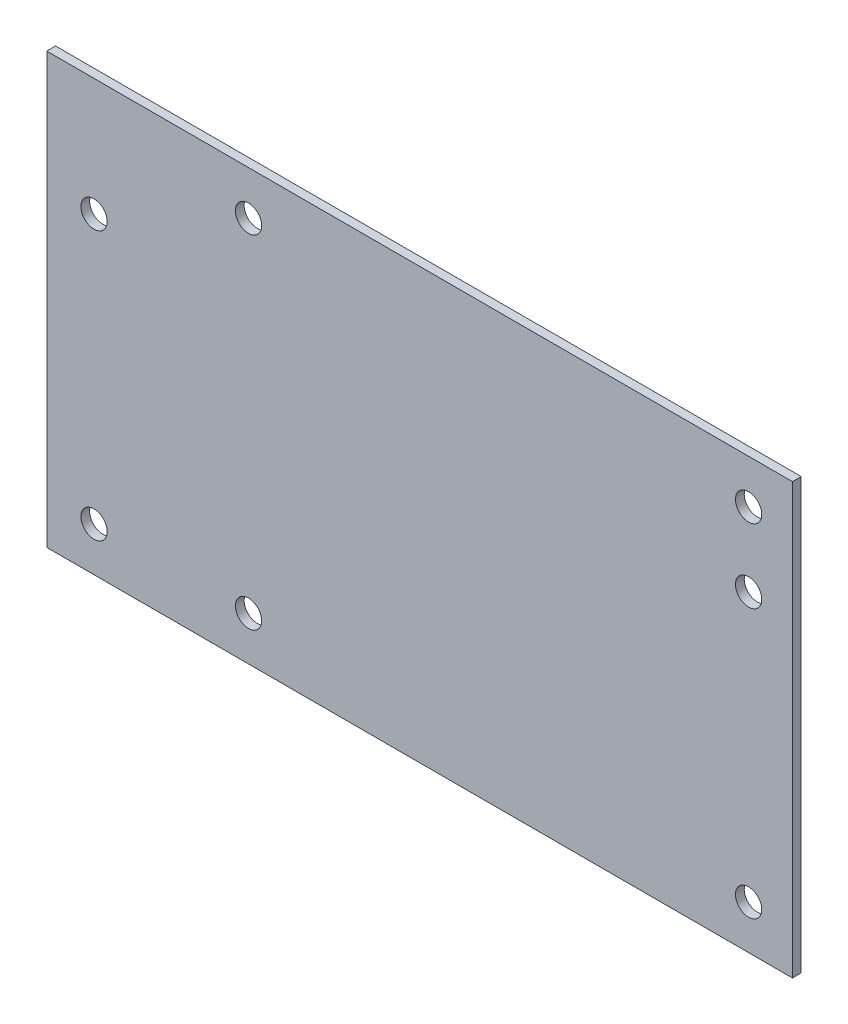
ISO-10303-21;
HEADER;
FILE_DESCRIPTION(('STEP AP214'),'2;1');
FILE_NAME('part.step','',(''),(''),'','','');
FILE_SCHEMA(('AUTOMOTIVE_DESIGN { 1 0 10303 214 1 1 1 1 }'));
ENDSEC;
DATA;
#1=APPLICATION_CONTEXT('core data for automotive mechanical design processes');
#2=APPLICATION_PROTOCOL_DEFINITION('international standard','automotive_design',2000,#1);
#3=PRODUCT_CONTEXT('',#1,'mechanical');
#4=PRODUCT('Part','Part','',(#3));
#5=PRODUCT_RELATED_PRODUCT_CATEGORY('part','',(#4));
#6=PRODUCT_DEFINITION_FORMATION('','',#4);
#7=PRODUCT_DEFINITION_CONTEXT('part definition',#1,'design');
#8=PRODUCT_DEFINITION('design','',#6,#7);
#9=PRODUCT_DEFINITION_SHAPE('','',#8);
#10=(LENGTH_UNIT() NAMED_UNIT(*) SI_UNIT(.MILLI.,.METRE.));
#11=(NAMED_UNIT(*) PLANE_ANGLE_UNIT() SI_UNIT($,.RADIAN.));
#12=(NAMED_UNIT(*) SI_UNIT($,.STERADIAN.) SOLID_ANGLE_UNIT());
#13=UNCERTAINTY_MEASURE_WITH_UNIT(LENGTH_MEASURE(1.E-05),#10,'distance_accuracy_value','');
#14=(GEOMETRIC_REPRESENTATION_CONTEXT(3) GLOBAL_UNCERTAINTY_ASSIGNED_CONTEXT((#13)) GLOBAL_UNIT_ASSIGNED_CONTEXT((#10,
#11,#12)) REPRESENTATION_CONTEXT('',''));
#15=CARTESIAN_POINT('',(0.,0.,0.));
#16=DIRECTION('',(0.,0.,1.));
#17=DIRECTION('',(1.,0.,0.));
#18=AXIS2_PLACEMENT_3D('',#15,#16,#17);
#19=CARTESIAN_POINT('',(0.,0.,0.));
#20=DIRECTION('',(0.,0.,1.));
#21=DIRECTION('',(1.,0.,0.));
#22=AXIS2_PLACEMENT_3D('',#19,#20,#21);
#23=PLANE('',#22);
#24=CARTESIAN_POINT('',(-5.,44.,0.));
#25=DIRECTION('',(0.,0.,-1.));
#26=DIRECTION('',(-1.,0.,0.));
#27=AXIS2_PLACEMENT_3D('',#24,#25,#26);
#28=CIRCLE('',#27,1.5);
#29=CARTESIAN_POINT('',(-6.5,44.,0.));
#30=VERTEX_POINT('',#29);
#31=EDGE_CURVE('E101',#30,#30,#28,.F.);
#32=ORIENTED_EDGE('',*,*,#31,.T.);
#33=EDGE_LOOP('',(#32));
#34=FACE_BOUND('',#33,.T.);
#35=CARTESIAN_POINT('',(-79.61,4.99999999999998,0.));
#36=DIRECTION('',(0.,0.,-1.));
#37=DIRECTION('',(-1.,0.,0.));
#38=AXIS2_PLACEMENT_3D('',#35,#36,#37);
#39=CIRCLE('',#38,1.49999999999999);
#40=CARTESIAN_POINT('',(-81.11,4.99999999999998,0.));
#41=VERTEX_POINT('',#40);
#42=EDGE_CURVE('E20',#41,#41,#39,.F.);
#43=ORIENTED_EDGE('',*,*,#42,.T.);
#44=EDGE_LOOP('',(#43));
#45=FACE_BOUND('',#44,.T.);
#46=CARTESIAN_POINT('',(-62.,4.99999999999999,0.));
#47=DIRECTION('',(0.,0.,-1.));
#48=DIRECTION('',(-1.,0.,0.));
#49=AXIS2_PLACEMENT_3D('',#46,#47,#48);
#50=CIRCLE('',#49,1.5);
#51=CARTESIAN_POINT('',(-63.5,4.99999999999999,0.));
#52=VERTEX_POINT('',#51);
#53=EDGE_CURVE('E104',#52,#52,#50,.F.);
#54=ORIENTED_EDGE('',*,*,#53,.T.);
#55=EDGE_LOOP('',(#54));
#56=FACE_BOUND('',#55,.T.);
#57=CARTESIAN_POINT('',(-79.61,35.61,0.));
#58=DIRECTION('',(0.,0.,-1.));
#59=DIRECTION('',(-1.,0.,0.));
#60=AXIS2_PLACEMENT_3D('',#57,#58,#59);
#61=CIRCLE('',#60,1.5);
#62=CARTESIAN_POINT('',(-81.11,35.61,0.));
#63=VERTEX_POINT('',#62);
#64=EDGE_CURVE('E115',#63,#63,#61,.F.);
#65=ORIENTED_EDGE('',*,*,#64,.T.);
#66=EDGE_LOOP('',(#65));
#67=FACE_BOUND('',#66,.T.);
#68=CARTESIAN_POINT('',(-4.99999999999998,35.61,0.));
#69=DIRECTION('',(0.,0.,-1.));
#70=DIRECTION('',(-1.,0.,0.));
#71=AXIS2_PLACEMENT_3D('',#68,#69,#70);
#72=CIRCLE('',#71,1.5);
#73=CARTESIAN_POINT('',(-6.49999999999998,35.61,0.));
#74=VERTEX_POINT('',#73);
#75=EDGE_CURVE('E107',#74,#74,#72,.F.);
#76=ORIENTED_EDGE('',*,*,#75,.T.);
#77=EDGE_LOOP('',(#76));
#78=FACE_BOUND('',#77,.T.);
#79=CARTESIAN_POINT('',(-62.,44.,0.));
#80=DIRECTION('',(0.,0.,-1.));
#81=DIRECTION('',(-1.,0.,0.));
#82=AXIS2_PLACEMENT_3D('',#79,#80,#81);
#83=CIRCLE('',#82,1.50000000000001);
#84=CARTESIAN_POINT('',(-63.5,44.,0.));
#85=VERTEX_POINT('',#84);
#86=EDGE_CURVE('E69',#85,#85,#83,.F.);
#87=ORIENTED_EDGE('',*,*,#86,.T.);
#88=EDGE_LOOP('',(#87));
#89=FACE_BOUND('',#88,.T.);
#90=CARTESIAN_POINT('',(-5.,5.,0.));
#91=DIRECTION('',(0.,0.,-1.));
#92=DIRECTION('',(-1.,0.,0.));
#93=AXIS2_PLACEMENT_3D('',#90,#91,#92);
#94=CIRCLE('',#93,1.5);
#95=CARTESIAN_POINT('',(-6.5,5.,0.));
#96=VERTEX_POINT('',#95);
#97=EDGE_CURVE('E110',#96,#96,#94,.F.);
#98=ORIENTED_EDGE('',*,*,#97,.T.);
#99=EDGE_LOOP('',(#98));
#100=FACE_BOUND('',#99,.T.);
#101=DIRECTION('',(-1.,0.,0.));
#102=VECTOR('',#101,1.);
#103=CARTESIAN_POINT('',(0.,0.,0.));
#104=LINE('',#103,#102);
#105=CARTESIAN_POINT('',(0.,0.,0.));
#106=VERTEX_POINT('',#105);
#107=CARTESIAN_POINT('',(-85.,0.,0.));
#108=VERTEX_POINT('',#107);
#109=EDGE_CURVE('E113',#106,#108,#104,.T.);
#110=ORIENTED_EDGE('',*,*,#109,.T.);
#111=DIRECTION('',(0.,1.,0.));
#112=VECTOR('',#111,1.);
#113=CARTESIAN_POINT('',(-85.,0.,0.));
#114=LINE('',#113,#112);
#115=CARTESIAN_POINT('',(-85.,49.,0.));
#116=VERTEX_POINT('',#115);
#117=EDGE_CURVE('E71',#108,#116,#114,.T.);
#118=ORIENTED_EDGE('',*,*,#117,.T.);
#119=DIRECTION('',(1.,0.,0.));
#120=VECTOR('',#119,1.);
#121=CARTESIAN_POINT('',(0.,49.,0.));
#122=LINE('',#121,#120);
#123=CARTESIAN_POINT('',(0.,49.,0.));
#124=VERTEX_POINT('',#123);
#125=EDGE_CURVE('E55',#116,#124,#122,.T.);
#126=ORIENTED_EDGE('',*,*,#125,.T.);
#127=DIRECTION('',(0.,1.,0.));
#128=VECTOR('',#127,1.);
#129=CARTESIAN_POINT('',(0.,0.,0.));
#130=LINE('',#129,#128);
#131=EDGE_CURVE('E60',#124,#106,#130,.F.);
#132=ORIENTED_EDGE('',*,*,#131,.T.);
#133=EDGE_LOOP('',(#110,#118,#126,#132));
#134=FACE_BOUND('',#133,.T.);
#135=ADVANCED_FACE('F17',(#34,#45,#56,#67,#78,#89,#100,#134),#23,.F.);
#136=CARTESIAN_POINT('',(-79.61,4.99999999999998,1.));
#137=DIRECTION('',(0.,0.,-1.));
#138=DIRECTION('',(-1.,0.,0.));
#139=AXIS2_PLACEMENT_3D('',#136,#137,#138);
#140=CYLINDRICAL_SURFACE('',#139,1.49999999999999);
#141=CARTESIAN_POINT('',(-79.61,4.99999999999998,1.));
#142=DIRECTION('',(0.,0.,-1.));
#143=DIRECTION('',(-1.,0.,0.));
#144=AXIS2_PLACEMENT_3D('',#141,#142,#143);
#145=CIRCLE('',#144,1.49999999999999);
#146=CARTESIAN_POINT('',(-81.11,4.99999999999998,1.));
#147=VERTEX_POINT('',#146);
#148=EDGE_CURVE('E98',#147,#147,#145,.T.);
#149=ORIENTED_EDGE('',*,*,#148,.F.);
#150=EDGE_LOOP('',(#149));
#151=FACE_BOUND('',#150,.T.);
#152=ORIENTED_EDGE('',*,*,#42,.F.);
#153=EDGE_LOOP('',(#152));
#154=FACE_BOUND('',#153,.T.);
#155=ADVANCED_FACE('F124',(#151,#154),#140,.F.);
#156=CARTESIAN_POINT('',(-79.61,35.61,1.));
#157=DIRECTION('',(0.,0.,-1.));
#158=DIRECTION('',(-1.,0.,0.));
#159=AXIS2_PLACEMENT_3D('',#156,#157,#158);
#160=CYLINDRICAL_SURFACE('',#159,1.5);
#161=CARTESIAN_POINT('',(-79.61,35.61,1.));
#162=DIRECTION('',(0.,0.,-1.));
#163=DIRECTION('',(-1.,0.,0.));
#164=AXIS2_PLACEMENT_3D('',#161,#162,#163);
#165=CIRCLE('',#164,1.5);
#166=CARTESIAN_POINT('',(-81.11,35.61,1.));
#167=VERTEX_POINT('',#166);
#168=EDGE_CURVE('E95',#167,#167,#165,.T.);
#169=ORIENTED_EDGE('',*,*,#168,.F.);
#170=EDGE_LOOP('',(#169));
#171=FACE_BOUND('',#170,.T.);
#172=ORIENTED_EDGE('',*,*,#64,.F.);
#173=EDGE_LOOP('',(#172));
#174=FACE_BOUND('',#173,.T.);
#175=ADVANCED_FACE('F126',(#171,#174),#160,.F.);
#176=CARTESIAN_POINT('',(-62.,44.,1.));
#177=DIRECTION('',(0.,0.,-1.));
#178=DIRECTION('',(-1.,0.,0.));
#179=AXIS2_PLACEMENT_3D('',#176,#177,#178);
#180=CYLINDRICAL_SURFACE('',#179,1.50000000000001);
#181=CARTESIAN_POINT('',(-62.,44.,1.));
#182=DIRECTION('',(0.,0.,-1.));
#183=DIRECTION('',(-1.,0.,0.));
#184=AXIS2_PLACEMENT_3D('',#181,#182,#183);
#185=CIRCLE('',#184,1.50000000000001);
#186=CARTESIAN_POINT('',(-63.5,44.,1.));
#187=VERTEX_POINT('',#186);
#188=EDGE_CURVE('E91',#187,#187,#185,.T.);
#189=ORIENTED_EDGE('',*,*,#188,.F.);
#190=EDGE_LOOP('',(#189));
#191=FACE_BOUND('',#190,.T.);
#192=ORIENTED_EDGE('',*,*,#86,.F.);
#193=EDGE_LOOP('',(#192));
#194=FACE_BOUND('',#193,.T.);
#195=ADVANCED_FACE('F133',(#191,#194),#180,.F.);
#196=CARTESIAN_POINT('',(0.,0.,1.));
#197=DIRECTION('',(-1.,0.,0.));
#198=DIRECTION('',(0.,0.,1.));
#199=AXIS2_PLACEMENT_3D('',#196,#197,#198);
#200=PLANE('',#199);
#201=DIRECTION('',(0.,0.,1.));
#202=VECTOR('',#201,1.);
#203=CARTESIAN_POINT('',(0.,49.,1.));
#204=LINE('',#203,#202);
#205=CARTESIAN_POINT('',(0.,49.,1.));
#206=VERTEX_POINT('',#205);
#207=EDGE_CURVE('E62',#124,#206,#204,.T.);
#208=ORIENTED_EDGE('',*,*,#207,.T.);
#209=DIRECTION('',(0.,1.,0.));
#210=VECTOR('',#209,1.);
#211=CARTESIAN_POINT('',(0.,0.,1.));
#212=LINE('',#211,#210);
#213=CARTESIAN_POINT('',(0.,0.,1.));
#214=VERTEX_POINT('',#213);
#215=EDGE_CURVE('E94',#214,#206,#212,.T.);
#216=ORIENTED_EDGE('',*,*,#215,.F.);
#217=DIRECTION('',(0.,0.,1.));
#218=VECTOR('',#217,1.);
#219=CARTESIAN_POINT('',(0.,0.,1.));
#220=LINE('',#219,#218);
#221=EDGE_CURVE('E65',#214,#106,#220,.F.);
#222=ORIENTED_EDGE('',*,*,#221,.T.);
#223=ORIENTED_EDGE('',*,*,#131,.F.);
#224=EDGE_LOOP('',(#208,#216,#222,#223));
#225=FACE_BOUND('',#224,.T.);
#226=ADVANCED_FACE('F61',(#225),#200,.F.);
#227=CARTESIAN_POINT('',(0.,49.,1.));
#228=DIRECTION('',(0.,-1.,0.));
#229=DIRECTION('',(1.,0.,0.));
#230=AXIS2_PLACEMENT_3D('',#227,#228,#229);
#231=PLANE('',#230);
#232=DIRECTION('',(0.,0.,-1.));
#233=VECTOR('',#232,1.);
#234=CARTESIAN_POINT('',(-85.,49.,1.));
#235=LINE('',#234,#233);
#236=CARTESIAN_POINT('',(-85.,49.,1.));
#237=VERTEX_POINT('',#236);
#238=EDGE_CURVE('E73',#116,#237,#235,.F.);
#239=ORIENTED_EDGE('',*,*,#238,.T.);
#240=DIRECTION('',(1.,0.,0.));
#241=VECTOR('',#240,1.);
#242=CARTESIAN_POINT('',(0.,49.,1.));
#243=LINE('',#242,#241);
#244=EDGE_CURVE('E77',#206,#237,#243,.F.);
#245=ORIENTED_EDGE('',*,*,#244,.F.);
#246=ORIENTED_EDGE('',*,*,#207,.F.);
#247=ORIENTED_EDGE('',*,*,#125,.F.);
#248=EDGE_LOOP('',(#239,#245,#246,#247));
#249=FACE_BOUND('',#248,.T.);
#250=ADVANCED_FACE('F75',(#249),#231,.F.);
#251=CARTESIAN_POINT('',(-85.,0.,1.));
#252=DIRECTION('',(1.,0.,0.));
#253=DIRECTION('',(0.,0.,-1.));
#254=AXIS2_PLACEMENT_3D('',#251,#252,#253);
#255=PLANE('',#254);
#256=DIRECTION('',(0.,0.,1.));
#257=VECTOR('',#256,1.);
#258=CARTESIAN_POINT('',(-85.,0.,1.));
#259=LINE('',#258,#257);
#260=CARTESIAN_POINT('',(-85.,0.,1.));
#261=VERTEX_POINT('',#260);
#262=EDGE_CURVE('E35',#108,#261,#259,.T.);
#263=ORIENTED_EDGE('',*,*,#262,.T.);
#264=DIRECTION('',(0.,1.,0.));
#265=VECTOR('',#264,1.);
#266=CARTESIAN_POINT('',(-85.,0.,1.));
#267=LINE('',#266,#265);
#268=EDGE_CURVE('E277',#237,#261,#267,.F.);
#269=ORIENTED_EDGE('',*,*,#268,.F.);
#270=ORIENTED_EDGE('',*,*,#238,.F.);
#271=ORIENTED_EDGE('',*,*,#117,.F.);
#272=EDGE_LOOP('',(#263,#269,#270,#271));
#273=FACE_BOUND('',#272,.T.);
#274=ADVANCED_FACE('F165',(#273),#255,.F.);
#275=CARTESIAN_POINT('',(0.,0.,1.));
#276=DIRECTION('',(0.,1.,0.));
#277=DIRECTION('',(-1.,0.,0.));
#278=AXIS2_PLACEMENT_3D('',#275,#276,#277);
#279=PLANE('',#278);
#280=ORIENTED_EDGE('',*,*,#221,.F.);
#281=DIRECTION('',(1.,0.,0.));
#282=VECTOR('',#281,1.);
#283=CARTESIAN_POINT('',(0.,0.,1.));
#284=LINE('',#283,#282);
#285=EDGE_CURVE('E90',#261,#214,#284,.T.);
#286=ORIENTED_EDGE('',*,*,#285,.F.);
#287=ORIENTED_EDGE('',*,*,#262,.F.);
#288=ORIENTED_EDGE('',*,*,#109,.F.);
#289=EDGE_LOOP('',(#280,#286,#287,#288));
#290=FACE_BOUND('',#289,.T.);
#291=ADVANCED_FACE('F161',(#290),#279,.F.);
#292=CARTESIAN_POINT('',(-5.,5.,1.));
#293=DIRECTION('',(0.,0.,-1.));
#294=DIRECTION('',(-1.,0.,0.));
#295=AXIS2_PLACEMENT_3D('',#292,#293,#294);
#296=CYLINDRICAL_SURFACE('',#295,1.5);
#297=CARTESIAN_POINT('',(-5.,5.,1.));
#298=DIRECTION('',(0.,0.,-1.));
#299=DIRECTION('',(-1.,0.,0.));
#300=AXIS2_PLACEMENT_3D('',#297,#298,#299);
#301=CIRCLE('',#300,1.5);
#302=CARTESIAN_POINT('',(-6.5,5.,1.));
#303=VERTEX_POINT('',#302);
#304=EDGE_CURVE('E87',#303,#303,#301,.T.);
#305=ORIENTED_EDGE('',*,*,#304,.F.);
#306=EDGE_LOOP('',(#305));
#307=FACE_BOUND('',#306,.T.);
#308=ORIENTED_EDGE('',*,*,#97,.F.);
#309=EDGE_LOOP('',(#308));
#310=FACE_BOUND('',#309,.T.);
#311=ADVANCED_FACE('F157',(#307,#310),#296,.F.);
#312=CARTESIAN_POINT('',(-4.99999999999998,35.61,1.));
#313=DIRECTION('',(0.,0.,-1.));
#314=DIRECTION('',(-1.,0.,0.));
#315=AXIS2_PLACEMENT_3D('',#312,#313,#314);
#316=CYLINDRICAL_SURFACE('',#315,1.5);
#317=CARTESIAN_POINT('',(-4.99999999999998,35.61,1.));
#318=DIRECTION('',(0.,0.,-1.));
#319=DIRECTION('',(-1.,0.,0.));
#320=AXIS2_PLACEMENT_3D('',#317,#318,#319);
#321=CIRCLE('',#320,1.5);
#322=CARTESIAN_POINT('',(-6.49999999999998,35.61,1.));
#323=VERTEX_POINT('',#322);
#324=EDGE_CURVE('E84',#323,#323,#321,.T.);
#325=ORIENTED_EDGE('',*,*,#324,.F.);
#326=EDGE_LOOP('',(#325));
#327=FACE_BOUND('',#326,.T.);
#328=ORIENTED_EDGE('',*,*,#75,.F.);
#329=EDGE_LOOP('',(#328));
#330=FACE_BOUND('',#329,.T.);
#331=ADVANCED_FACE('F153',(#327,#330),#316,.F.);
#332=CARTESIAN_POINT('',(-62.,4.99999999999999,1.));
#333=DIRECTION('',(0.,0.,-1.));
#334=DIRECTION('',(-1.,0.,0.));
#335=AXIS2_PLACEMENT_3D('',#332,#333,#334);
#336=CYLINDRICAL_SURFACE('',#335,1.5);
#337=CARTESIAN_POINT('',(-62.,4.99999999999999,1.));
#338=DIRECTION('',(0.,0.,-1.));
#339=DIRECTION('',(-1.,0.,0.));
#340=AXIS2_PLACEMENT_3D('',#337,#338,#339);
#341=CIRCLE('',#340,1.5);
#342=CARTESIAN_POINT('',(-63.5,4.99999999999999,1.));
#343=VERTEX_POINT('',#342);
#344=EDGE_CURVE('E26',#343,#343,#341,.T.);
#345=ORIENTED_EDGE('',*,*,#344,.F.);
#346=EDGE_LOOP('',(#345));
#347=FACE_BOUND('',#346,.T.);
#348=ORIENTED_EDGE('',*,*,#53,.F.);
#349=EDGE_LOOP('',(#348));
#350=FACE_BOUND('',#349,.T.);
#351=ADVANCED_FACE('F146',(#347,#350),#336,.F.);
#352=CARTESIAN_POINT('',(-5.,44.,1.));
#353=DIRECTION('',(0.,0.,-1.));
#354=DIRECTION('',(-1.,0.,0.));
#355=AXIS2_PLACEMENT_3D('',#352,#353,#354);
#356=CYLINDRICAL_SURFACE('',#355,1.5);
#357=CARTESIAN_POINT('',(-5.,44.,1.));
#358=DIRECTION('',(0.,0.,-1.));
#359=DIRECTION('',(-1.,0.,0.));
#360=AXIS2_PLACEMENT_3D('',#357,#358,#359);
#361=CIRCLE('',#360,1.5);
#362=CARTESIAN_POINT('',(-6.5,44.,1.));
#363=VERTEX_POINT('',#362);
#364=EDGE_CURVE('E11',#363,#363,#361,.T.);
#365=ORIENTED_EDGE('',*,*,#364,.F.);
#366=EDGE_LOOP('',(#365));
#367=FACE_BOUND('',#366,.T.);
#368=ORIENTED_EDGE('',*,*,#31,.F.);
#369=EDGE_LOOP('',(#368));
#370=FACE_BOUND('',#369,.T.);
#371=ADVANCED_FACE('F140',(#367,#370),#356,.F.);
#372=CARTESIAN_POINT('',(0.,0.,1.));
#373=DIRECTION('',(0.,0.,1.));
#374=DIRECTION('',(1.,0.,0.));
#375=AXIS2_PLACEMENT_3D('',#372,#373,#374);
#376=PLANE('',#375);
#377=ORIENTED_EDGE('',*,*,#364,.T.);
#378=EDGE_LOOP('',(#377));
#379=FACE_BOUND('',#378,.T.);
#380=ORIENTED_EDGE('',*,*,#344,.T.);
#381=EDGE_LOOP('',(#380));
#382=FACE_BOUND('',#381,.T.);
#383=ORIENTED_EDGE('',*,*,#324,.T.);
#384=EDGE_LOOP('',(#383));
#385=FACE_BOUND('',#384,.T.);
#386=ORIENTED_EDGE('',*,*,#304,.T.);
#387=EDGE_LOOP('',(#386));
#388=FACE_BOUND('',#387,.T.);
#389=ORIENTED_EDGE('',*,*,#268,.T.);
#390=ORIENTED_EDGE('',*,*,#285,.T.);
#391=ORIENTED_EDGE('',*,*,#215,.T.);
#392=ORIENTED_EDGE('',*,*,#244,.T.);
#393=EDGE_LOOP('',(#389,#390,#391,#392));
#394=FACE_BOUND('',#393,.T.);
#395=ORIENTED_EDGE('',*,*,#188,.T.);
#396=EDGE_LOOP('',(#395));
#397=FACE_BOUND('',#396,.T.);
#398=ORIENTED_EDGE('',*,*,#168,.T.);
#399=EDGE_LOOP('',(#398));
#400=FACE_BOUND('',#399,.T.);
#401=ORIENTED_EDGE('',*,*,#148,.T.);
#402=EDGE_LOOP('',(#401));
#403=FACE_BOUND('',#402,.T.);
#404=ADVANCED_FACE('F138',(#379,#382,#385,#388,#394,#397,#400,#403),#376,.T.);
#405=CLOSED_SHELL('',(#135,#155,#175,#195,#226,#250,#274,#291,#311,#331,#351,#371,#404));
#406=MANIFOLD_SOLID_BREP('B1',#405);
#407=ADVANCED_BREP_SHAPE_REPRESENTATION('',(#18,#406),#14);
#408=SHAPE_DEFINITION_REPRESENTATION(#9,#407);
ENDSEC;
END-ISO-10303-21;
